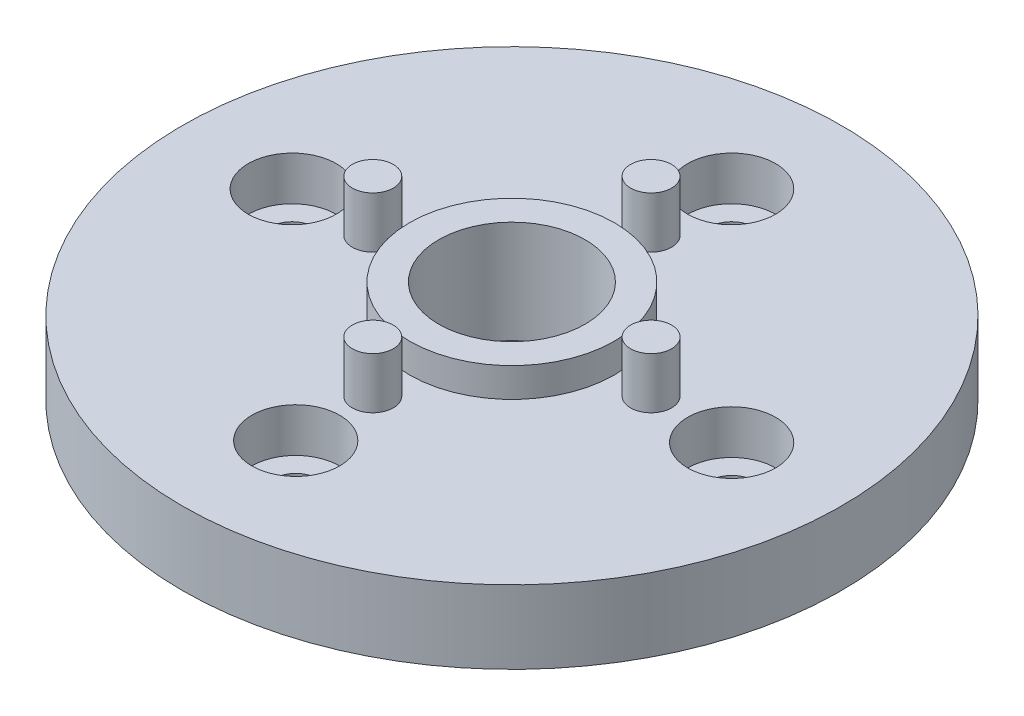
ISO-10303-21;
HEADER;
FILE_DESCRIPTION(('STEP AP214'),'2;1');
FILE_NAME('part.step','',(''),(''),'','','');
FILE_SCHEMA(('AUTOMOTIVE_DESIGN { 1 0 10303 214 1 1 1 1 }'));
ENDSEC;
DATA;
#1=APPLICATION_CONTEXT('core data for automotive mechanical design processes');
#2=APPLICATION_PROTOCOL_DEFINITION('international standard','automotive_design',2000,#1);
#3=PRODUCT_CONTEXT('',#1,'mechanical');
#4=PRODUCT('Part','Part','',(#3));
#5=PRODUCT_RELATED_PRODUCT_CATEGORY('part','',(#4));
#6=PRODUCT_DEFINITION_FORMATION('','',#4);
#7=PRODUCT_DEFINITION_CONTEXT('part definition',#1,'design');
#8=PRODUCT_DEFINITION('design','',#6,#7);
#9=PRODUCT_DEFINITION_SHAPE('','',#8);
#10=(LENGTH_UNIT() NAMED_UNIT(*) SI_UNIT(.MILLI.,.METRE.));
#11=(NAMED_UNIT(*) PLANE_ANGLE_UNIT() SI_UNIT($,.RADIAN.));
#12=(NAMED_UNIT(*) SI_UNIT($,.STERADIAN.) SOLID_ANGLE_UNIT());
#13=UNCERTAINTY_MEASURE_WITH_UNIT(LENGTH_MEASURE(1.E-05),#10,'distance_accuracy_value','');
#14=(GEOMETRIC_REPRESENTATION_CONTEXT(3) GLOBAL_UNCERTAINTY_ASSIGNED_CONTEXT((#13)) GLOBAL_UNIT_ASSIGNED_CONTEXT((#10,
#11,#12)) REPRESENTATION_CONTEXT('',''));
#15=CARTESIAN_POINT('',(0.,0.,0.));
#16=DIRECTION('',(0.,0.,1.));
#17=DIRECTION('',(1.,0.,0.));
#18=AXIS2_PLACEMENT_3D('',#15,#16,#17);
#19=CARTESIAN_POINT('',(-15.,-11.,0.));
#20=DIRECTION('',(0.,1.,0.));
#21=DIRECTION('',(0.,0.,1.));
#22=AXIS2_PLACEMENT_3D('',#19,#20,#21);
#23=CYLINDRICAL_SURFACE('',#22,1.5);
#24=CARTESIAN_POINT('',(-15.,-5.,0.));
#25=DIRECTION('',(0.,1.,0.));
#26=DIRECTION('',(0.,0.,1.));
#27=AXIS2_PLACEMENT_3D('',#24,#25,#26);
#28=CIRCLE('',#27,1.5);
#29=CARTESIAN_POINT('',(-15.,-5.,1.5));
#30=VERTEX_POINT('',#29);
#31=EDGE_CURVE('E68',#30,#30,#28,.T.);
#32=ORIENTED_EDGE('',*,*,#31,.F.);
#33=EDGE_LOOP('',(#32));
#34=FACE_BOUND('',#33,.T.);
#35=CARTESIAN_POINT('',(-15.,-3.,0.));
#36=DIRECTION('',(0.,1.,0.));
#37=DIRECTION('',(0.,0.,1.));
#38=AXIS2_PLACEMENT_3D('',#35,#36,#37);
#39=CIRCLE('',#38,1.5);
#40=CARTESIAN_POINT('',(-15.,-3.,1.5));
#41=VERTEX_POINT('',#40);
#42=EDGE_CURVE('E66',#41,#41,#39,.F.);
#43=ORIENTED_EDGE('',*,*,#42,.F.);
#44=EDGE_LOOP('',(#43));
#45=FACE_BOUND('',#44,.T.);
#46=ADVANCED_FACE('F39',(#34,#45),#23,.F.);
#47=CARTESIAN_POINT('',(0.,-11.,14.760226483985));
#48=DIRECTION('',(0.,1.,0.));
#49=DIRECTION('',(0.,0.,1.));
#50=AXIS2_PLACEMENT_3D('',#47,#48,#49);
#51=CYLINDRICAL_SURFACE('',#50,1.5);
#52=CARTESIAN_POINT('',(0.,-5.,14.760226483985));
#53=DIRECTION('',(0.,1.,0.));
#54=DIRECTION('',(0.,0.,1.));
#55=AXIS2_PLACEMENT_3D('',#52,#53,#54);
#56=CIRCLE('',#55,1.5);
#57=CARTESIAN_POINT('',(0.,-5.,16.260226483985));
#58=VERTEX_POINT('',#57);
#59=EDGE_CURVE('E72',#58,#58,#56,.T.);
#60=ORIENTED_EDGE('',*,*,#59,.F.);
#61=EDGE_LOOP('',(#60));
#62=FACE_BOUND('',#61,.T.);
#63=CARTESIAN_POINT('',(0.,-3.,14.760226483985));
#64=DIRECTION('',(0.,1.,0.));
#65=DIRECTION('',(0.,0.,1.));
#66=AXIS2_PLACEMENT_3D('',#63,#64,#65);
#67=CIRCLE('',#66,1.5);
#68=CARTESIAN_POINT('',(0.,-3.,16.260226483985));
#69=VERTEX_POINT('',#68);
#70=EDGE_CURVE('E64',#69,#69,#67,.F.);
#71=ORIENTED_EDGE('',*,*,#70,.F.);
#72=EDGE_LOOP('',(#71));
#73=FACE_BOUND('',#72,.T.);
#74=ADVANCED_FACE('F114',(#62,#73),#51,.F.);
#75=CARTESIAN_POINT('',(15.,-11.,0.));
#76=DIRECTION('',(0.,1.,0.));
#77=DIRECTION('',(0.,0.,1.));
#78=AXIS2_PLACEMENT_3D('',#75,#76,#77);
#79=CYLINDRICAL_SURFACE('',#78,1.5);
#80=CARTESIAN_POINT('',(15.,-5.,0.));
#81=DIRECTION('',(0.,1.,0.));
#82=DIRECTION('',(0.,0.,1.));
#83=AXIS2_PLACEMENT_3D('',#80,#81,#82);
#84=CIRCLE('',#83,1.5);
#85=CARTESIAN_POINT('',(15.,-5.,1.5));
#86=VERTEX_POINT('',#85);
#87=EDGE_CURVE('E77',#86,#86,#84,.T.);
#88=ORIENTED_EDGE('',*,*,#87,.F.);
#89=EDGE_LOOP('',(#88));
#90=FACE_BOUND('',#89,.T.);
#91=CARTESIAN_POINT('',(15.,-3.,0.));
#92=DIRECTION('',(0.,1.,0.));
#93=DIRECTION('',(0.,0.,1.));
#94=AXIS2_PLACEMENT_3D('',#91,#92,#93);
#95=CIRCLE('',#94,1.5);
#96=CARTESIAN_POINT('',(15.,-3.,1.5));
#97=VERTEX_POINT('',#96);
#98=EDGE_CURVE('E60',#97,#97,#95,.F.);
#99=ORIENTED_EDGE('',*,*,#98,.F.);
#100=EDGE_LOOP('',(#99));
#101=FACE_BOUND('',#100,.T.);
#102=ADVANCED_FACE('F93',(#90,#101),#79,.F.);
#103=CARTESIAN_POINT('',(0.,-11.,-15.));
#104=DIRECTION('',(0.,1.,0.));
#105=DIRECTION('',(0.,0.,1.));
#106=AXIS2_PLACEMENT_3D('',#103,#104,#105);
#107=CYLINDRICAL_SURFACE('',#106,1.5);
#108=CARTESIAN_POINT('',(0.,-5.,-15.));
#109=DIRECTION('',(0.,1.,0.));
#110=DIRECTION('',(0.,0.,1.));
#111=AXIS2_PLACEMENT_3D('',#108,#109,#110);
#112=CIRCLE('',#111,1.5);
#113=CARTESIAN_POINT('',(0.,-5.,-13.5));
#114=VERTEX_POINT('',#113);
#115=EDGE_CURVE('E52',#114,#114,#112,.T.);
#116=ORIENTED_EDGE('',*,*,#115,.F.);
#117=EDGE_LOOP('',(#116));
#118=FACE_BOUND('',#117,.T.);
#119=CARTESIAN_POINT('',(0.,-3.,-15.));
#120=DIRECTION('',(0.,1.,0.));
#121=DIRECTION('',(0.,0.,1.));
#122=AXIS2_PLACEMENT_3D('',#119,#120,#121);
#123=CIRCLE('',#122,1.5);
#124=CARTESIAN_POINT('',(0.,-3.,-13.5));
#125=VERTEX_POINT('',#124);
#126=EDGE_CURVE('E57',#125,#125,#123,.F.);
#127=ORIENTED_EDGE('',*,*,#126,.F.);
#128=EDGE_LOOP('',(#127));
#129=FACE_BOUND('',#128,.T.);
#130=ADVANCED_FACE('F90',(#118,#129),#107,.F.);
#131=CARTESIAN_POINT('',(0.,-5.,0.));
#132=DIRECTION('',(0.,1.,0.));
#133=DIRECTION('',(0.,0.,1.));
#134=AXIS2_PLACEMENT_3D('',#131,#132,#133);
#135=CYLINDRICAL_SURFACE('',#134,22.5);
#136=CARTESIAN_POINT('',(0.,-5.,0.));
#137=DIRECTION('',(0.,1.,0.));
#138=DIRECTION('',(0.,0.,1.));
#139=AXIS2_PLACEMENT_3D('',#136,#137,#138);
#140=CIRCLE('',#139,22.5);
#141=CARTESIAN_POINT('',(0.,-5.,22.5));
#142=VERTEX_POINT('',#141);
#143=EDGE_CURVE('E10',#142,#142,#140,.T.);
#144=ORIENTED_EDGE('',*,*,#143,.T.);
#145=EDGE_LOOP('',(#144));
#146=FACE_BOUND('',#145,.T.);
#147=CARTESIAN_POINT('',(0.,0.,0.));
#148=DIRECTION('',(0.,1.,0.));
#149=DIRECTION('',(0.,0.,1.));
#150=AXIS2_PLACEMENT_3D('',#147,#148,#149);
#151=CIRCLE('',#150,22.5);
#152=CARTESIAN_POINT('',(0.,0.,22.5));
#153=VERTEX_POINT('',#152);
#154=EDGE_CURVE('E47',#153,#153,#151,.T.);
#155=ORIENTED_EDGE('',*,*,#154,.F.);
#156=EDGE_LOOP('',(#155));
#157=FACE_BOUND('',#156,.T.);
#158=ADVANCED_FACE('F41',(#146,#157),#135,.T.);
#159=CARTESIAN_POINT('',(0.,-5.,0.));
#160=DIRECTION('',(0.,1.,0.));
#161=DIRECTION('',(0.,0.,1.));
#162=AXIS2_PLACEMENT_3D('',#159,#160,#161);
#163=PLANE('',#162);
#164=CARTESIAN_POINT('',(0.,-5.,0.));
#165=DIRECTION('',(0.,1.,0.));
#166=DIRECTION('',(0.,0.,1.));
#167=AXIS2_PLACEMENT_3D('',#164,#165,#166);
#168=CIRCLE('',#167,5.);
#169=CARTESIAN_POINT('',(0.,-5.,5.));
#170=VERTEX_POINT('',#169);
#171=EDGE_CURVE('E132',#170,#170,#168,.F.);
#172=ORIENTED_EDGE('',*,*,#171,.F.);
#173=EDGE_LOOP('',(#172));
#174=FACE_BOUND('',#173,.T.);
#175=ORIENTED_EDGE('',*,*,#115,.T.);
#176=EDGE_LOOP('',(#175));
#177=FACE_BOUND('',#176,.T.);
#178=ORIENTED_EDGE('',*,*,#87,.T.);
#179=EDGE_LOOP('',(#178));
#180=FACE_BOUND('',#179,.T.);
#181=ORIENTED_EDGE('',*,*,#59,.T.);
#182=EDGE_LOOP('',(#181));
#183=FACE_BOUND('',#182,.T.);
#184=ORIENTED_EDGE('',*,*,#31,.T.);
#185=EDGE_LOOP('',(#184));
#186=FACE_BOUND('',#185,.T.);
#187=ORIENTED_EDGE('',*,*,#143,.F.);
#188=EDGE_LOOP('',(#187));
#189=FACE_BOUND('',#188,.T.);
#190=ADVANCED_FACE('F88',(#174,#177,#180,#183,#186,#189),#163,.F.);
#191=CARTESIAN_POINT('',(0.,0.,0.));
#192=DIRECTION('',(0.,1.,0.));
#193=DIRECTION('',(0.,0.,1.));
#194=AXIS2_PLACEMENT_3D('',#191,#192,#193);
#195=PLANE('',#194);
#196=CARTESIAN_POINT('',(0.,0.,0.));
#197=DIRECTION('',(0.,1.,0.));
#198=DIRECTION('',(0.,0.,1.));
#199=AXIS2_PLACEMENT_3D('',#196,#197,#198);
#200=CIRCLE('',#199,7.);
#201=CARTESIAN_POINT('',(0.,0.,7.));
#202=VERTEX_POINT('',#201);
#203=EDGE_CURVE('E134',#202,#202,#200,.T.);
#204=ORIENTED_EDGE('',*,*,#203,.F.);
#205=EDGE_LOOP('',(#204));
#206=FACE_BOUND('',#205,.T.);
#207=CARTESIAN_POINT('',(-9.5,0.,0.));
#208=DIRECTION('',(0.,1.,0.));
#209=DIRECTION('',(0.,0.,1.));
#210=AXIS2_PLACEMENT_3D('',#207,#208,#209);
#211=CIRCLE('',#210,1.4);
#212=CARTESIAN_POINT('',(-9.5,0.,1.4));
#213=VERTEX_POINT('',#212);
#214=EDGE_CURVE('E144',#213,#213,#211,.T.);
#215=ORIENTED_EDGE('',*,*,#214,.F.);
#216=EDGE_LOOP('',(#215));
#217=FACE_BOUND('',#216,.T.);
#218=CARTESIAN_POINT('',(0.,0.,9.5));
#219=DIRECTION('',(0.,1.,0.));
#220=DIRECTION('',(0.,0.,1.));
#221=AXIS2_PLACEMENT_3D('',#218,#219,#220);
#222=CIRCLE('',#221,1.4);
#223=CARTESIAN_POINT('',(0.,0.,10.9));
#224=VERTEX_POINT('',#223);
#225=EDGE_CURVE('E150',#224,#224,#222,.T.);
#226=ORIENTED_EDGE('',*,*,#225,.F.);
#227=EDGE_LOOP('',(#226));
#228=FACE_BOUND('',#227,.T.);
#229=CARTESIAN_POINT('',(9.5,0.,0.));
#230=DIRECTION('',(0.,1.,0.));
#231=DIRECTION('',(0.,0.,1.));
#232=AXIS2_PLACEMENT_3D('',#229,#230,#231);
#233=CIRCLE('',#232,1.4);
#234=CARTESIAN_POINT('',(9.5,0.,1.4));
#235=VERTEX_POINT('',#234);
#236=EDGE_CURVE('E156',#235,#235,#233,.T.);
#237=ORIENTED_EDGE('',*,*,#236,.F.);
#238=EDGE_LOOP('',(#237));
#239=FACE_BOUND('',#238,.T.);
#240=CARTESIAN_POINT('',(0.,0.,-9.5));
#241=DIRECTION('',(0.,1.,0.));
#242=DIRECTION('',(0.,0.,1.));
#243=AXIS2_PLACEMENT_3D('',#240,#241,#242);
#244=CIRCLE('',#243,1.4);
#245=CARTESIAN_POINT('',(0.,0.,-8.1));
#246=VERTEX_POINT('',#245);
#247=EDGE_CURVE('E159',#246,#246,#244,.T.);
#248=ORIENTED_EDGE('',*,*,#247,.F.);
#249=EDGE_LOOP('',(#248));
#250=FACE_BOUND('',#249,.T.);
#251=CARTESIAN_POINT('',(0.,0.,-15.));
#252=DIRECTION('',(0.,1.,0.));
#253=DIRECTION('',(0.,0.,1.));
#254=AXIS2_PLACEMENT_3D('',#251,#252,#253);
#255=CIRCLE('',#254,3.);
#256=CARTESIAN_POINT('',(0.,0.,-12.));
#257=VERTEX_POINT('',#256);
#258=EDGE_CURVE('E168',#257,#257,#255,.T.);
#259=ORIENTED_EDGE('',*,*,#258,.F.);
#260=EDGE_LOOP('',(#259));
#261=FACE_BOUND('',#260,.T.);
#262=CARTESIAN_POINT('',(15.,0.,0.));
#263=DIRECTION('',(0.,1.,0.));
#264=DIRECTION('',(0.,0.,1.));
#265=AXIS2_PLACEMENT_3D('',#262,#263,#264);
#266=CIRCLE('',#265,3.);
#267=CARTESIAN_POINT('',(15.,0.,3.));
#268=VERTEX_POINT('',#267);
#269=EDGE_CURVE('E171',#268,#268,#266,.T.);
#270=ORIENTED_EDGE('',*,*,#269,.F.);
#271=EDGE_LOOP('',(#270));
#272=FACE_BOUND('',#271,.T.);
#273=CARTESIAN_POINT('',(0.,0.,14.760226483985));
#274=DIRECTION('',(0.,1.,0.));
#275=DIRECTION('',(0.,0.,1.));
#276=AXIS2_PLACEMENT_3D('',#273,#274,#275);
#277=CIRCLE('',#276,3.);
#278=CARTESIAN_POINT('',(0.,0.,17.760226483985));
#279=VERTEX_POINT('',#278);
#280=EDGE_CURVE('E177',#279,#279,#277,.T.);
#281=ORIENTED_EDGE('',*,*,#280,.F.);
#282=EDGE_LOOP('',(#281));
#283=FACE_BOUND('',#282,.T.);
#284=CARTESIAN_POINT('',(-15.,0.,0.));
#285=DIRECTION('',(0.,1.,0.));
#286=DIRECTION('',(0.,0.,1.));
#287=AXIS2_PLACEMENT_3D('',#284,#285,#286);
#288=CIRCLE('',#287,3.);
#289=CARTESIAN_POINT('',(-15.,0.,3.));
#290=VERTEX_POINT('',#289);
#291=EDGE_CURVE('E182',#290,#290,#288,.T.);
#292=ORIENTED_EDGE('',*,*,#291,.F.);
#293=EDGE_LOOP('',(#292));
#294=FACE_BOUND('',#293,.T.);
#295=ORIENTED_EDGE('',*,*,#154,.T.);
#296=EDGE_LOOP('',(#295));
#297=FACE_BOUND('',#296,.T.);
#298=ADVANCED_FACE('F100',(#206,#217,#228,#239,#250,#261,#272,#283,#294,#297),#195,.T.);
#299=CARTESIAN_POINT('',(0.,-3.,-15.));
#300=DIRECTION('',(0.,1.,0.));
#301=DIRECTION('',(0.,0.,1.));
#302=AXIS2_PLACEMENT_3D('',#299,#300,#301);
#303=PLANE('',#302);
#304=CARTESIAN_POINT('',(0.,-3.,-15.));
#305=DIRECTION('',(0.,1.,0.));
#306=DIRECTION('',(0.,0.,1.));
#307=AXIS2_PLACEMENT_3D('',#304,#305,#306);
#308=CIRCLE('',#307,3.);
#309=CARTESIAN_POINT('',(0.,-3.,-12.));
#310=VERTEX_POINT('',#309);
#311=EDGE_CURVE('E61',#310,#310,#308,.T.);
#312=ORIENTED_EDGE('',*,*,#311,.T.);
#313=EDGE_LOOP('',(#312));
#314=FACE_BOUND('',#313,.T.);
#315=ORIENTED_EDGE('',*,*,#126,.T.);
#316=EDGE_LOOP('',(#315));
#317=FACE_BOUND('',#316,.T.);
#318=ADVANCED_FACE('F97',(#314,#317),#303,.T.);
#319=CARTESIAN_POINT('',(0.,-3.,-15.));
#320=DIRECTION('',(0.,1.,0.));
#321=DIRECTION('',(0.,0.,1.));
#322=AXIS2_PLACEMENT_3D('',#319,#320,#321);
#323=CYLINDRICAL_SURFACE('',#322,3.);
#324=ORIENTED_EDGE('',*,*,#311,.F.);
#325=EDGE_LOOP('',(#324));
#326=FACE_BOUND('',#325,.T.);
#327=ORIENTED_EDGE('',*,*,#258,.T.);
#328=EDGE_LOOP('',(#327));
#329=FACE_BOUND('',#328,.T.);
#330=ADVANCED_FACE('F99',(#326,#329),#323,.F.);
#331=CARTESIAN_POINT('',(15.,-3.,0.));
#332=DIRECTION('',(0.,1.,0.));
#333=DIRECTION('',(0.,0.,1.));
#334=AXIS2_PLACEMENT_3D('',#331,#332,#333);
#335=PLANE('',#334);
#336=CARTESIAN_POINT('',(15.,-3.,0.));
#337=DIRECTION('',(0.,1.,0.));
#338=DIRECTION('',(0.,0.,1.));
#339=AXIS2_PLACEMENT_3D('',#336,#337,#338);
#340=CIRCLE('',#339,3.);
#341=CARTESIAN_POINT('',(15.,-3.,3.));
#342=VERTEX_POINT('',#341);
#343=EDGE_CURVE('E174',#342,#342,#340,.T.);
#344=ORIENTED_EDGE('',*,*,#343,.T.);
#345=EDGE_LOOP('',(#344));
#346=FACE_BOUND('',#345,.T.);
#347=ORIENTED_EDGE('',*,*,#98,.T.);
#348=EDGE_LOOP('',(#347));
#349=FACE_BOUND('',#348,.T.);
#350=ADVANCED_FACE('F107',(#346,#349),#335,.T.);
#351=CARTESIAN_POINT('',(15.,-3.,0.));
#352=DIRECTION('',(0.,1.,0.));
#353=DIRECTION('',(0.,0.,1.));
#354=AXIS2_PLACEMENT_3D('',#351,#352,#353);
#355=CYLINDRICAL_SURFACE('',#354,3.);
#356=ORIENTED_EDGE('',*,*,#343,.F.);
#357=EDGE_LOOP('',(#356));
#358=FACE_BOUND('',#357,.T.);
#359=ORIENTED_EDGE('',*,*,#269,.T.);
#360=EDGE_LOOP('',(#359));
#361=FACE_BOUND('',#360,.T.);
#362=ADVANCED_FACE('F214',(#358,#361),#355,.F.);
#363=CARTESIAN_POINT('',(0.,-3.,14.760226483985));
#364=DIRECTION('',(0.,1.,0.));
#365=DIRECTION('',(0.,0.,1.));
#366=AXIS2_PLACEMENT_3D('',#363,#364,#365);
#367=PLANE('',#366);
#368=CARTESIAN_POINT('',(0.,-3.,14.760226483985));
#369=DIRECTION('',(0.,1.,0.));
#370=DIRECTION('',(0.,0.,1.));
#371=AXIS2_PLACEMENT_3D('',#368,#369,#370);
#372=CIRCLE('',#371,3.);
#373=CARTESIAN_POINT('',(0.,-3.,17.760226483985));
#374=VERTEX_POINT('',#373);
#375=EDGE_CURVE('E180',#374,#374,#372,.T.);
#376=ORIENTED_EDGE('',*,*,#375,.T.);
#377=EDGE_LOOP('',(#376));
#378=FACE_BOUND('',#377,.T.);
#379=ORIENTED_EDGE('',*,*,#70,.T.);
#380=EDGE_LOOP('',(#379));
#381=FACE_BOUND('',#380,.T.);
#382=ADVANCED_FACE('F204',(#378,#381),#367,.T.);
#383=CARTESIAN_POINT('',(0.,-3.,14.760226483985));
#384=DIRECTION('',(0.,1.,0.));
#385=DIRECTION('',(0.,0.,1.));
#386=AXIS2_PLACEMENT_3D('',#383,#384,#385);
#387=CYLINDRICAL_SURFACE('',#386,3.);
#388=ORIENTED_EDGE('',*,*,#375,.F.);
#389=EDGE_LOOP('',(#388));
#390=FACE_BOUND('',#389,.T.);
#391=ORIENTED_EDGE('',*,*,#280,.T.);
#392=EDGE_LOOP('',(#391));
#393=FACE_BOUND('',#392,.T.);
#394=ADVANCED_FACE('F201',(#390,#393),#387,.F.);
#395=CARTESIAN_POINT('',(-15.,-3.,0.));
#396=DIRECTION('',(0.,1.,0.));
#397=DIRECTION('',(0.,0.,1.));
#398=AXIS2_PLACEMENT_3D('',#395,#396,#397);
#399=PLANE('',#398);
#400=CARTESIAN_POINT('',(-15.,-3.,0.));
#401=DIRECTION('',(0.,1.,0.));
#402=DIRECTION('',(0.,0.,1.));
#403=AXIS2_PLACEMENT_3D('',#400,#401,#402);
#404=CIRCLE('',#403,3.);
#405=CARTESIAN_POINT('',(-15.,-3.,3.));
#406=VERTEX_POINT('',#405);
#407=EDGE_CURVE('E80',#406,#406,#404,.T.);
#408=ORIENTED_EDGE('',*,*,#407,.T.);
#409=EDGE_LOOP('',(#408));
#410=FACE_BOUND('',#409,.T.);
#411=ORIENTED_EDGE('',*,*,#42,.T.);
#412=EDGE_LOOP('',(#411));
#413=FACE_BOUND('',#412,.T.);
#414=ADVANCED_FACE('F189',(#410,#413),#399,.T.);
#415=CARTESIAN_POINT('',(-15.,-3.,0.));
#416=DIRECTION('',(0.,1.,0.));
#417=DIRECTION('',(0.,0.,1.));
#418=AXIS2_PLACEMENT_3D('',#415,#416,#417);
#419=CYLINDRICAL_SURFACE('',#418,3.);
#420=ORIENTED_EDGE('',*,*,#407,.F.);
#421=EDGE_LOOP('',(#420));
#422=FACE_BOUND('',#421,.T.);
#423=ORIENTED_EDGE('',*,*,#291,.T.);
#424=EDGE_LOOP('',(#423));
#425=FACE_BOUND('',#424,.T.);
#426=ADVANCED_FACE('F191',(#422,#425),#419,.F.);
#427=CARTESIAN_POINT('',(0.,3.5,-9.5));
#428=DIRECTION('',(0.,-1.,0.));
#429=DIRECTION('',(0.,0.,-1.));
#430=AXIS2_PLACEMENT_3D('',#427,#428,#429);
#431=CYLINDRICAL_SURFACE('',#430,1.4);
#432=CARTESIAN_POINT('',(0.,3.5,-9.5));
#433=DIRECTION('',(0.,1.,0.));
#434=DIRECTION('',(0.,0.,1.));
#435=AXIS2_PLACEMENT_3D('',#432,#433,#434);
#436=CIRCLE('',#435,1.4);
#437=CARTESIAN_POINT('',(0.,3.5,-8.1));
#438=VERTEX_POINT('',#437);
#439=EDGE_CURVE('E162',#438,#438,#436,.T.);
#440=ORIENTED_EDGE('',*,*,#439,.F.);
#441=EDGE_LOOP('',(#440));
#442=FACE_BOUND('',#441,.T.);
#443=ORIENTED_EDGE('',*,*,#247,.T.);
#444=EDGE_LOOP('',(#443));
#445=FACE_BOUND('',#444,.T.);
#446=ADVANCED_FACE('F193',(#442,#445),#431,.T.);
#447=CARTESIAN_POINT('',(0.,3.5,-9.5));
#448=DIRECTION('',(0.,1.,0.));
#449=DIRECTION('',(0.,0.,1.));
#450=AXIS2_PLACEMENT_3D('',#447,#448,#449);
#451=PLANE('',#450);
#452=ORIENTED_EDGE('',*,*,#439,.T.);
#453=EDGE_LOOP('',(#452));
#454=FACE_BOUND('',#453,.T.);
#455=ADVANCED_FACE('F199',(#454),#451,.T.);
#456=CARTESIAN_POINT('',(9.5,3.5,0.));
#457=DIRECTION('',(0.,-1.,0.));
#458=DIRECTION('',(0.,0.,-1.));
#459=AXIS2_PLACEMENT_3D('',#456,#457,#458);
#460=CYLINDRICAL_SURFACE('',#459,1.4);
#461=CARTESIAN_POINT('',(9.5,3.5,0.));
#462=DIRECTION('',(0.,1.,0.));
#463=DIRECTION('',(0.,0.,1.));
#464=AXIS2_PLACEMENT_3D('',#461,#462,#463);
#465=CIRCLE('',#464,1.4);
#466=CARTESIAN_POINT('',(9.5,3.5,1.4));
#467=VERTEX_POINT('',#466);
#468=EDGE_CURVE('E153',#467,#467,#465,.T.);
#469=ORIENTED_EDGE('',*,*,#468,.F.);
#470=EDGE_LOOP('',(#469));
#471=FACE_BOUND('',#470,.T.);
#472=ORIENTED_EDGE('',*,*,#236,.T.);
#473=EDGE_LOOP('',(#472));
#474=FACE_BOUND('',#473,.T.);
#475=ADVANCED_FACE('F401',(#471,#474),#460,.T.);
#476=CARTESIAN_POINT('',(9.5,3.5,0.));
#477=DIRECTION('',(0.,1.,0.));
#478=DIRECTION('',(0.,0.,1.));
#479=AXIS2_PLACEMENT_3D('',#476,#477,#478);
#480=PLANE('',#479);
#481=ORIENTED_EDGE('',*,*,#468,.T.);
#482=EDGE_LOOP('',(#481));
#483=FACE_BOUND('',#482,.T.);
#484=ADVANCED_FACE('F391',(#483),#480,.T.);
#485=CARTESIAN_POINT('',(0.,3.5,9.5));
#486=DIRECTION('',(0.,-1.,0.));
#487=DIRECTION('',(0.,0.,-1.));
#488=AXIS2_PLACEMENT_3D('',#485,#486,#487);
#489=CYLINDRICAL_SURFACE('',#488,1.4);
#490=CARTESIAN_POINT('',(0.,3.5,9.5));
#491=DIRECTION('',(0.,1.,0.));
#492=DIRECTION('',(0.,0.,1.));
#493=AXIS2_PLACEMENT_3D('',#490,#491,#492);
#494=CIRCLE('',#493,1.4);
#495=CARTESIAN_POINT('',(0.,3.5,10.9));
#496=VERTEX_POINT('',#495);
#497=EDGE_CURVE('E147',#496,#496,#494,.T.);
#498=ORIENTED_EDGE('',*,*,#497,.F.);
#499=EDGE_LOOP('',(#498));
#500=FACE_BOUND('',#499,.T.);
#501=ORIENTED_EDGE('',*,*,#225,.T.);
#502=EDGE_LOOP('',(#501));
#503=FACE_BOUND('',#502,.T.);
#504=ADVANCED_FACE('F381',(#500,#503),#489,.T.);
#505=CARTESIAN_POINT('',(0.,3.5,9.5));
#506=DIRECTION('',(0.,1.,0.));
#507=DIRECTION('',(0.,0.,1.));
#508=AXIS2_PLACEMENT_3D('',#505,#506,#507);
#509=PLANE('',#508);
#510=ORIENTED_EDGE('',*,*,#497,.T.);
#511=EDGE_LOOP('',(#510));
#512=FACE_BOUND('',#511,.T.);
#513=ADVANCED_FACE('F372',(#512),#509,.T.);
#514=CARTESIAN_POINT('',(-9.5,3.5,0.));
#515=DIRECTION('',(0.,-1.,0.));
#516=DIRECTION('',(0.,0.,-1.));
#517=AXIS2_PLACEMENT_3D('',#514,#515,#516);
#518=CYLINDRICAL_SURFACE('',#517,1.4);
#519=CARTESIAN_POINT('',(-9.5,3.5,0.));
#520=DIRECTION('',(0.,1.,0.));
#521=DIRECTION('',(0.,0.,1.));
#522=AXIS2_PLACEMENT_3D('',#519,#520,#521);
#523=CIRCLE('',#522,1.4);
#524=CARTESIAN_POINT('',(-9.5,3.5,1.4));
#525=VERTEX_POINT('',#524);
#526=EDGE_CURVE('E142',#525,#525,#523,.T.);
#527=ORIENTED_EDGE('',*,*,#526,.F.);
#528=EDGE_LOOP('',(#527));
#529=FACE_BOUND('',#528,.T.);
#530=ORIENTED_EDGE('',*,*,#214,.T.);
#531=EDGE_LOOP('',(#530));
#532=FACE_BOUND('',#531,.T.);
#533=ADVANCED_FACE('F364',(#529,#532),#518,.T.);
#534=CARTESIAN_POINT('',(-9.5,3.5,0.));
#535=DIRECTION('',(0.,1.,0.));
#536=DIRECTION('',(0.,0.,1.));
#537=AXIS2_PLACEMENT_3D('',#534,#535,#536);
#538=PLANE('',#537);
#539=ORIENTED_EDGE('',*,*,#526,.T.);
#540=EDGE_LOOP('',(#539));
#541=FACE_BOUND('',#540,.T.);
#542=ADVANCED_FACE('F320',(#541),#538,.T.);
#543=CARTESIAN_POINT('',(0.,2.,0.));
#544=DIRECTION('',(0.,-1.,0.));
#545=DIRECTION('',(0.,0.,-1.));
#546=AXIS2_PLACEMENT_3D('',#543,#544,#545);
#547=CYLINDRICAL_SURFACE('',#546,7.);
#548=CARTESIAN_POINT('',(0.,2.,0.));
#549=DIRECTION('',(0.,1.,0.));
#550=DIRECTION('',(0.,0.,1.));
#551=AXIS2_PLACEMENT_3D('',#548,#549,#550);
#552=CIRCLE('',#551,7.);
#553=CARTESIAN_POINT('',(0.,2.,7.));
#554=VERTEX_POINT('',#553);
#555=EDGE_CURVE('E137',#554,#554,#552,.T.);
#556=ORIENTED_EDGE('',*,*,#555,.F.);
#557=EDGE_LOOP('',(#556));
#558=FACE_BOUND('',#557,.T.);
#559=ORIENTED_EDGE('',*,*,#203,.T.);
#560=EDGE_LOOP('',(#559));
#561=FACE_BOUND('',#560,.T.);
#562=ADVANCED_FACE('F325',(#558,#561),#547,.T.);
#563=CARTESIAN_POINT('',(0.,2.,0.));
#564=DIRECTION('',(0.,1.,0.));
#565=DIRECTION('',(0.,0.,1.));
#566=AXIS2_PLACEMENT_3D('',#563,#564,#565);
#567=PLANE('',#566);
#568=CARTESIAN_POINT('',(0.,2.,0.));
#569=DIRECTION('',(0.,1.,0.));
#570=DIRECTION('',(0.,0.,1.));
#571=AXIS2_PLACEMENT_3D('',#568,#569,#570);
#572=CIRCLE('',#571,5.);
#573=CARTESIAN_POINT('',(0.,2.,5.));
#574=VERTEX_POINT('',#573);
#575=EDGE_CURVE('E43',#574,#574,#572,.F.);
#576=ORIENTED_EDGE('',*,*,#575,.T.);
#577=EDGE_LOOP('',(#576));
#578=FACE_BOUND('',#577,.T.);
#579=ORIENTED_EDGE('',*,*,#555,.T.);
#580=EDGE_LOOP('',(#579));
#581=FACE_BOUND('',#580,.T.);
#582=ADVANCED_FACE('F329',(#578,#581),#567,.T.);
#583=CARTESIAN_POINT('',(0.,14.,0.));
#584=DIRECTION('',(0.,-1.,0.));
#585=DIRECTION('',(0.,0.,-1.));
#586=AXIS2_PLACEMENT_3D('',#583,#584,#585);
#587=CYLINDRICAL_SURFACE('',#586,5.);
#588=ORIENTED_EDGE('',*,*,#575,.F.);
#589=EDGE_LOOP('',(#588));
#590=FACE_BOUND('',#589,.T.);
#591=ORIENTED_EDGE('',*,*,#171,.T.);
#592=EDGE_LOOP('',(#591));
#593=FACE_BOUND('',#592,.T.);
#594=ADVANCED_FACE('F342',(#590,#593),#587,.F.);
#595=CLOSED_SHELL('',(#46,#74,#102,#130,#158,#190,#298,#318,#330,#350,#362,#382,#394,#414,#426,
#446,#455,#475,#484,#504,#513,#533,#542,#562,#582,#594));
#596=MANIFOLD_SOLID_BREP('B2',#595);
#597=ADVANCED_BREP_SHAPE_REPRESENTATION('',(#18,#596),#14);
#598=SHAPE_DEFINITION_REPRESENTATION(#9,#597);
ENDSEC;
END-ISO-10303-21;
